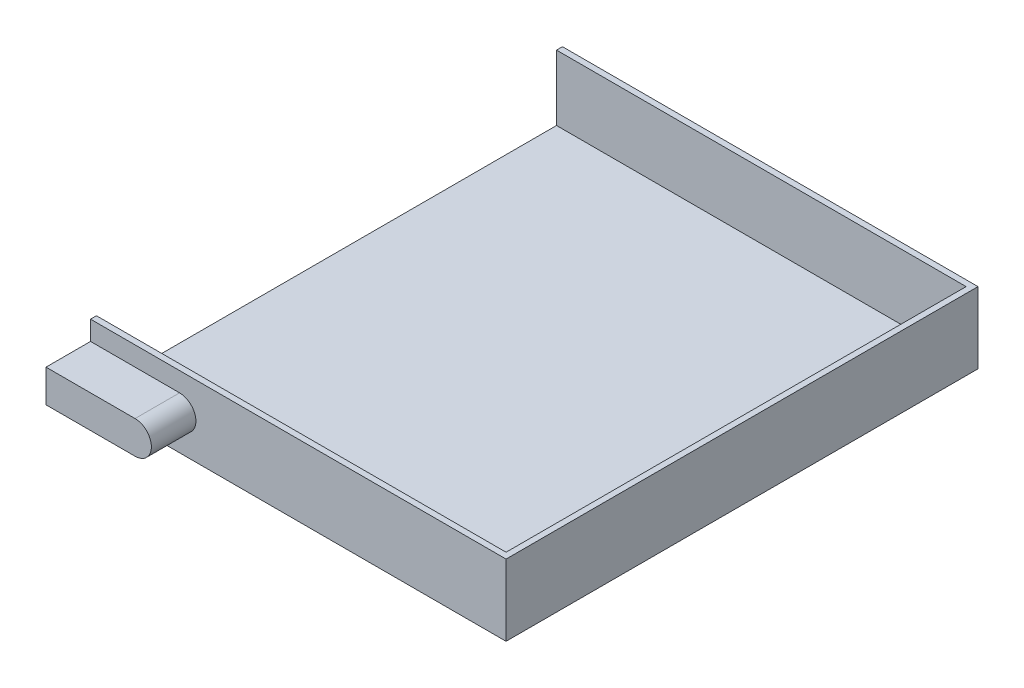
ISO-10303-21;
HEADER;
FILE_DESCRIPTION(('STEP AP214'),'2;1');
FILE_NAME('part.step','',(''),(''),'','','');
FILE_SCHEMA(('AUTOMOTIVE_DESIGN { 1 0 10303 214 1 1 1 1 }'));
ENDSEC;
DATA;
#1=APPLICATION_CONTEXT('core data for automotive mechanical design processes');
#2=APPLICATION_PROTOCOL_DEFINITION('international standard','automotive_design',2000,#1);
#3=PRODUCT_CONTEXT('',#1,'mechanical');
#4=PRODUCT('Part','Part','',(#3));
#5=PRODUCT_RELATED_PRODUCT_CATEGORY('part','',(#4));
#6=PRODUCT_DEFINITION_FORMATION('','',#4);
#7=PRODUCT_DEFINITION_CONTEXT('part definition',#1,'design');
#8=PRODUCT_DEFINITION('design','',#6,#7);
#9=PRODUCT_DEFINITION_SHAPE('','',#8);
#10=(LENGTH_UNIT() NAMED_UNIT(*) SI_UNIT(.MILLI.,.METRE.));
#11=(NAMED_UNIT(*) PLANE_ANGLE_UNIT() SI_UNIT($,.RADIAN.));
#12=(NAMED_UNIT(*) SI_UNIT($,.STERADIAN.) SOLID_ANGLE_UNIT());
#13=UNCERTAINTY_MEASURE_WITH_UNIT(LENGTH_MEASURE(1.E-05),#10,'distance_accuracy_value','');
#14=(GEOMETRIC_REPRESENTATION_CONTEXT(3) GLOBAL_UNCERTAINTY_ASSIGNED_CONTEXT((#13)) GLOBAL_UNIT_ASSIGNED_CONTEXT((#10,
#11,#12)) REPRESENTATION_CONTEXT('',''));
#15=CARTESIAN_POINT('',(0.,0.,0.));
#16=DIRECTION('',(0.,0.,1.));
#17=DIRECTION('',(1.,0.,0.));
#18=AXIS2_PLACEMENT_3D('',#15,#16,#17);
#19=CARTESIAN_POINT('',(0.,22.,157.));
#20=DIRECTION('',(0.,0.,-1.));
#21=DIRECTION('',(-1.,0.,0.));
#22=AXIS2_PLACEMENT_3D('',#19,#20,#21);
#23=PLANE('',#22);
#24=DIRECTION('',(1.,0.,0.));
#25=VECTOR('',#24,1.);
#26=CARTESIAN_POINT('',(30.,4.50000000000001,157.));
#27=LINE('',#26,#25);
#28=CARTESIAN_POINT('',(0.,4.5,157.));
#29=VERTEX_POINT('',#28);
#30=CARTESIAN_POINT('',(30.,4.50000000000001,157.));
#31=VERTEX_POINT('',#30);
#32=EDGE_CURVE('E144',#29,#31,#27,.T.);
#33=ORIENTED_EDGE('',*,*,#32,.F.);
#34=DIRECTION('',(0.,-1.,0.));
#35=VECTOR('',#34,1.);
#36=CARTESIAN_POINT('',(0.,22.,157.));
#37=LINE('',#36,#35);
#38=CARTESIAN_POINT('',(0.,-2.,157.));
#39=VERTEX_POINT('',#38);
#40=EDGE_CURVE('E47',#29,#39,#37,.T.);
#41=ORIENTED_EDGE('',*,*,#40,.T.);
#42=DIRECTION('',(1.,0.,0.));
#43=VECTOR('',#42,1.);
#44=CARTESIAN_POINT('',(0.,-2.,157.));
#45=LINE('',#44,#43);
#46=CARTESIAN_POINT('',(140.,-2.,157.));
#47=VERTEX_POINT('',#46);
#48=EDGE_CURVE('E186',#39,#47,#45,.T.);
#49=ORIENTED_EDGE('',*,*,#48,.T.);
#50=DIRECTION('',(0.,-1.,0.));
#51=VECTOR('',#50,1.);
#52=CARTESIAN_POINT('',(140.,22.,157.));
#53=LINE('',#52,#51);
#54=CARTESIAN_POINT('',(140.,22.,157.));
#55=VERTEX_POINT('',#54);
#56=EDGE_CURVE('E189',#55,#47,#53,.T.);
#57=ORIENTED_EDGE('',*,*,#56,.F.);
#58=DIRECTION('',(1.,0.,0.));
#59=VECTOR('',#58,1.);
#60=CARTESIAN_POINT('',(0.,22.,157.));
#61=LINE('',#60,#59);
#62=CARTESIAN_POINT('',(0.,22.,157.));
#63=VERTEX_POINT('',#62);
#64=EDGE_CURVE('E184',#63,#55,#61,.T.);
#65=ORIENTED_EDGE('',*,*,#64,.F.);
#66=CARTESIAN_POINT('',(0.,15.5,157.));
#67=VERTEX_POINT('',#66);
#68=EDGE_CURVE('E11',#63,#67,#37,.T.);
#69=ORIENTED_EDGE('',*,*,#68,.T.);
#70=DIRECTION('',(-1.,0.,0.));
#71=VECTOR('',#70,1.);
#72=CARTESIAN_POINT('',(30.,15.5,157.));
#73=LINE('',#72,#71);
#74=CARTESIAN_POINT('',(30.,15.5,157.));
#75=VERTEX_POINT('',#74);
#76=EDGE_CURVE('E58',#75,#67,#73,.T.);
#77=ORIENTED_EDGE('',*,*,#76,.F.);
#78=CARTESIAN_POINT('',(30.,10.,157.));
#79=DIRECTION('',(0.,0.,1.));
#80=DIRECTION('',(1.,0.,0.));
#81=AXIS2_PLACEMENT_3D('',#78,#79,#80);
#82=CIRCLE('',#81,5.5);
#83=EDGE_CURVE('E54',#31,#75,#82,.T.);
#84=ORIENTED_EDGE('',*,*,#83,.F.);
#85=EDGE_LOOP('',(#33,#41,#49,#57,#65,#69,#77,#84));
#86=FACE_BOUND('',#85,.T.);
#87=ADVANCED_FACE('F39',(#86),#23,.F.);
#88=CARTESIAN_POINT('',(0.,22.,0.));
#89=DIRECTION('',(1.,0.,0.));
#90=DIRECTION('',(0.,0.,-1.));
#91=AXIS2_PLACEMENT_3D('',#88,#89,#90);
#92=PLANE('',#91);
#93=DIRECTION('',(0.,0.,1.));
#94=VECTOR('',#93,1.);
#95=CARTESIAN_POINT('',(0.,22.,0.));
#96=LINE('',#95,#94);
#97=CARTESIAN_POINT('',(0.,22.,155.));
#98=VERTEX_POINT('',#97);
#99=EDGE_CURVE('E185',#98,#63,#96,.T.);
#100=ORIENTED_EDGE('',*,*,#99,.F.);
#101=DIRECTION('',(0.,-1.,0.));
#102=VECTOR('',#101,1.);
#103=CARTESIAN_POINT('',(0.,22.,155.));
#104=LINE('',#103,#102);
#105=CARTESIAN_POINT('',(0.,0.,155.));
#106=VERTEX_POINT('',#105);
#107=EDGE_CURVE('E177',#98,#106,#104,.T.);
#108=ORIENTED_EDGE('',*,*,#107,.T.);
#109=DIRECTION('',(0.,0.,1.));
#110=VECTOR('',#109,1.);
#111=CARTESIAN_POINT('',(0.,0.,0.));
#112=LINE('',#111,#110);
#113=CARTESIAN_POINT('',(0.,0.,0.));
#114=VERTEX_POINT('',#113);
#115=EDGE_CURVE('E147',#114,#106,#112,.T.);
#116=ORIENTED_EDGE('',*,*,#115,.F.);
#117=DIRECTION('',(0.,-1.,0.));
#118=VECTOR('',#117,1.);
#119=CARTESIAN_POINT('',(0.,22.,0.));
#120=LINE('',#119,#118);
#121=CARTESIAN_POINT('',(0.,22.,0.));
#122=VERTEX_POINT('',#121);
#123=EDGE_CURVE('E163',#122,#114,#120,.T.);
#124=ORIENTED_EDGE('',*,*,#123,.F.);
#125=CARTESIAN_POINT('',(0.,22.,-2.));
#126=VERTEX_POINT('',#125);
#127=EDGE_CURVE('E181',#126,#122,#96,.T.);
#128=ORIENTED_EDGE('',*,*,#127,.F.);
#129=DIRECTION('',(0.,-1.,0.));
#130=VECTOR('',#129,1.);
#131=CARTESIAN_POINT('',(0.,22.,-2.));
#132=LINE('',#131,#130);
#133=CARTESIAN_POINT('',(0.,-2.,-2.));
#134=VERTEX_POINT('',#133);
#135=EDGE_CURVE('E197',#126,#134,#132,.T.);
#136=ORIENTED_EDGE('',*,*,#135,.T.);
#137=DIRECTION('',(0.,0.,1.));
#138=VECTOR('',#137,1.);
#139=CARTESIAN_POINT('',(0.,-2.,0.));
#140=LINE('',#139,#138);
#141=EDGE_CURVE('E180',#134,#39,#140,.T.);
#142=ORIENTED_EDGE('',*,*,#141,.T.);
#143=ORIENTED_EDGE('',*,*,#40,.F.);
#144=DIRECTION('',(0.,0.,-1.));
#145=VECTOR('',#144,1.);
#146=CARTESIAN_POINT('',(0.,4.5,172.));
#147=LINE('',#146,#145);
#148=CARTESIAN_POINT('',(0.,4.5,172.));
#149=VERTEX_POINT('',#148);
#150=EDGE_CURVE('E152',#149,#29,#147,.T.);
#151=ORIENTED_EDGE('',*,*,#150,.F.);
#152=DIRECTION('',(0.,-1.,0.));
#153=VECTOR('',#152,1.);
#154=CARTESIAN_POINT('',(0.,15.5,172.));
#155=LINE('',#154,#153);
#156=CARTESIAN_POINT('',(0.,15.5,172.));
#157=VERTEX_POINT('',#156);
#158=EDGE_CURVE('E134',#157,#149,#155,.T.);
#159=ORIENTED_EDGE('',*,*,#158,.F.);
#160=DIRECTION('',(0.,0.,-1.));
#161=VECTOR('',#160,1.);
#162=CARTESIAN_POINT('',(0.,15.5,172.));
#163=LINE('',#162,#161);
#164=EDGE_CURVE('E131',#157,#67,#163,.T.);
#165=ORIENTED_EDGE('',*,*,#164,.T.);
#166=ORIENTED_EDGE('',*,*,#68,.F.);
#167=EDGE_LOOP('',(#100,#108,#116,#124,#128,#136,#142,#143,#151,#159,#165,#166));
#168=FACE_BOUND('',#167,.T.);
#169=ADVANCED_FACE('F210',(#168),#92,.F.);
#170=CARTESIAN_POINT('',(140.,22.,0.));
#171=DIRECTION('',(-1.,0.,0.));
#172=DIRECTION('',(0.,0.,1.));
#173=AXIS2_PLACEMENT_3D('',#170,#171,#172);
#174=PLANE('',#173);
#175=DIRECTION('',(0.,0.,-1.));
#176=VECTOR('',#175,1.);
#177=CARTESIAN_POINT('',(140.,-2.,0.));
#178=LINE('',#177,#176);
#179=CARTESIAN_POINT('',(140.,-2.,-2.));
#180=VERTEX_POINT('',#179);
#181=EDGE_CURVE('E188',#47,#180,#178,.T.);
#182=ORIENTED_EDGE('',*,*,#181,.T.);
#183=DIRECTION('',(0.,-1.,0.));
#184=VECTOR('',#183,1.);
#185=CARTESIAN_POINT('',(140.,22.,-2.));
#186=LINE('',#185,#184);
#187=CARTESIAN_POINT('',(140.,22.,-2.));
#188=VERTEX_POINT('',#187);
#189=EDGE_CURVE('E192',#188,#180,#186,.T.);
#190=ORIENTED_EDGE('',*,*,#189,.F.);
#191=DIRECTION('',(0.,0.,-1.));
#192=VECTOR('',#191,1.);
#193=CARTESIAN_POINT('',(140.,22.,0.));
#194=LINE('',#193,#192);
#195=EDGE_CURVE('E200',#55,#188,#194,.T.);
#196=ORIENTED_EDGE('',*,*,#195,.F.);
#197=ORIENTED_EDGE('',*,*,#56,.T.);
#198=EDGE_LOOP('',(#182,#190,#196,#197));
#199=FACE_BOUND('',#198,.T.);
#200=ADVANCED_FACE('F223',(#199),#174,.F.);
#201=CARTESIAN_POINT('',(0.,22.,-2.));
#202=DIRECTION('',(0.,0.,1.));
#203=DIRECTION('',(1.,0.,0.));
#204=AXIS2_PLACEMENT_3D('',#201,#202,#203);
#205=PLANE('',#204);
#206=DIRECTION('',(-1.,0.,0.));
#207=VECTOR('',#206,1.);
#208=CARTESIAN_POINT('',(0.,-2.,-2.));
#209=LINE('',#208,#207);
#210=EDGE_CURVE('E194',#180,#134,#209,.T.);
#211=ORIENTED_EDGE('',*,*,#210,.T.);
#212=ORIENTED_EDGE('',*,*,#135,.F.);
#213=DIRECTION('',(-1.,0.,0.));
#214=VECTOR('',#213,1.);
#215=CARTESIAN_POINT('',(0.,22.,-2.));
#216=LINE('',#215,#214);
#217=EDGE_CURVE('E202',#188,#126,#216,.T.);
#218=ORIENTED_EDGE('',*,*,#217,.F.);
#219=ORIENTED_EDGE('',*,*,#189,.T.);
#220=EDGE_LOOP('',(#211,#212,#218,#219));
#221=FACE_BOUND('',#220,.T.);
#222=ADVANCED_FACE('F256',(#221),#205,.F.);
#223=CARTESIAN_POINT('',(0.,22.,0.));
#224=DIRECTION('',(0.,1.,0.));
#225=DIRECTION('',(0.,0.,1.));
#226=AXIS2_PLACEMENT_3D('',#223,#224,#225);
#227=PLANE('',#226);
#228=DIRECTION('',(1.,0.,0.));
#229=VECTOR('',#228,1.);
#230=CARTESIAN_POINT('',(0.,22.,155.));
#231=LINE('',#230,#229);
#232=CARTESIAN_POINT('',(138.,22.,155.));
#233=VERTEX_POINT('',#232);
#234=EDGE_CURVE('E156',#98,#233,#231,.T.);
#235=ORIENTED_EDGE('',*,*,#234,.F.);
#236=ORIENTED_EDGE('',*,*,#99,.T.);
#237=ORIENTED_EDGE('',*,*,#64,.T.);
#238=ORIENTED_EDGE('',*,*,#195,.T.);
#239=ORIENTED_EDGE('',*,*,#217,.T.);
#240=ORIENTED_EDGE('',*,*,#127,.T.);
#241=DIRECTION('',(-1.,0.,0.));
#242=VECTOR('',#241,1.);
#243=CARTESIAN_POINT('',(0.,22.,0.));
#244=LINE('',#243,#242);
#245=CARTESIAN_POINT('',(138.,22.,0.));
#246=VERTEX_POINT('',#245);
#247=EDGE_CURVE('E162',#246,#122,#244,.T.);
#248=ORIENTED_EDGE('',*,*,#247,.F.);
#249=DIRECTION('',(0.,0.,-1.));
#250=VECTOR('',#249,1.);
#251=CARTESIAN_POINT('',(138.,22.,0.));
#252=LINE('',#251,#250);
#253=EDGE_CURVE('E158',#233,#246,#252,.T.);
#254=ORIENTED_EDGE('',*,*,#253,.F.);
#255=EDGE_LOOP('',(#235,#236,#237,#238,#239,#240,#248,#254));
#256=FACE_BOUND('',#255,.T.);
#257=ADVANCED_FACE('F228',(#256),#227,.T.);
#258=CARTESIAN_POINT('',(0.,-2.,0.));
#259=DIRECTION('',(0.,1.,0.));
#260=DIRECTION('',(0.,0.,1.));
#261=AXIS2_PLACEMENT_3D('',#258,#259,#260);
#262=PLANE('',#261);
#263=ORIENTED_EDGE('',*,*,#141,.F.);
#264=ORIENTED_EDGE('',*,*,#210,.F.);
#265=ORIENTED_EDGE('',*,*,#181,.F.);
#266=ORIENTED_EDGE('',*,*,#48,.F.);
#267=EDGE_LOOP('',(#263,#264,#265,#266));
#268=FACE_BOUND('',#267,.T.);
#269=ADVANCED_FACE('F41',(#268),#262,.F.);
#270=CARTESIAN_POINT('',(0.,22.,155.));
#271=DIRECTION('',(0.,0.,-1.));
#272=DIRECTION('',(-1.,0.,0.));
#273=AXIS2_PLACEMENT_3D('',#270,#271,#272);
#274=PLANE('',#273);
#275=DIRECTION('',(1.,0.,0.));
#276=VECTOR('',#275,1.);
#277=CARTESIAN_POINT('',(0.,0.,155.));
#278=LINE('',#277,#276);
#279=CARTESIAN_POINT('',(138.,0.,155.));
#280=VERTEX_POINT('',#279);
#281=EDGE_CURVE('E150',#106,#280,#278,.T.);
#282=ORIENTED_EDGE('',*,*,#281,.F.);
#283=ORIENTED_EDGE('',*,*,#107,.F.);
#284=ORIENTED_EDGE('',*,*,#234,.T.);
#285=DIRECTION('',(0.,-1.,0.));
#286=VECTOR('',#285,1.);
#287=CARTESIAN_POINT('',(138.,22.,155.));
#288=LINE('',#287,#286);
#289=EDGE_CURVE('E174',#233,#280,#288,.T.);
#290=ORIENTED_EDGE('',*,*,#289,.T.);
#291=EDGE_LOOP('',(#282,#283,#284,#290));
#292=FACE_BOUND('',#291,.T.);
#293=ADVANCED_FACE('F274',(#292),#274,.T.);
#294=CARTESIAN_POINT('',(138.,22.,0.));
#295=DIRECTION('',(-1.,0.,0.));
#296=DIRECTION('',(0.,0.,1.));
#297=AXIS2_PLACEMENT_3D('',#294,#295,#296);
#298=PLANE('',#297);
#299=DIRECTION('',(0.,0.,-1.));
#300=VECTOR('',#299,1.);
#301=CARTESIAN_POINT('',(138.,0.,0.));
#302=LINE('',#301,#300);
#303=CARTESIAN_POINT('',(138.,0.,0.));
#304=VERTEX_POINT('',#303);
#305=EDGE_CURVE('E166',#280,#304,#302,.T.);
#306=ORIENTED_EDGE('',*,*,#305,.F.);
#307=ORIENTED_EDGE('',*,*,#289,.F.);
#308=ORIENTED_EDGE('',*,*,#253,.T.);
#309=DIRECTION('',(0.,-1.,0.));
#310=VECTOR('',#309,1.);
#311=CARTESIAN_POINT('',(138.,22.,0.));
#312=LINE('',#311,#310);
#313=EDGE_CURVE('E171',#246,#304,#312,.T.);
#314=ORIENTED_EDGE('',*,*,#313,.T.);
#315=EDGE_LOOP('',(#306,#307,#308,#314));
#316=FACE_BOUND('',#315,.T.);
#317=ADVANCED_FACE('F272',(#316),#298,.T.);
#318=CARTESIAN_POINT('',(0.,22.,0.));
#319=DIRECTION('',(0.,0.,1.));
#320=DIRECTION('',(1.,0.,0.));
#321=AXIS2_PLACEMENT_3D('',#318,#319,#320);
#322=PLANE('',#321);
#323=DIRECTION('',(-1.,0.,0.));
#324=VECTOR('',#323,1.);
#325=CARTESIAN_POINT('',(0.,0.,0.));
#326=LINE('',#325,#324);
#327=EDGE_CURVE('E159',#304,#114,#326,.T.);
#328=ORIENTED_EDGE('',*,*,#327,.F.);
#329=ORIENTED_EDGE('',*,*,#313,.F.);
#330=ORIENTED_EDGE('',*,*,#247,.T.);
#331=ORIENTED_EDGE('',*,*,#123,.T.);
#332=EDGE_LOOP('',(#328,#329,#330,#331));
#333=FACE_BOUND('',#332,.T.);
#334=ADVANCED_FACE('F268',(#333),#322,.T.);
#335=CARTESIAN_POINT('',(0.,0.,0.));
#336=DIRECTION('',(0.,1.,0.));
#337=DIRECTION('',(0.,0.,1.));
#338=AXIS2_PLACEMENT_3D('',#335,#336,#337);
#339=PLANE('',#338);
#340=ORIENTED_EDGE('',*,*,#115,.T.);
#341=ORIENTED_EDGE('',*,*,#281,.T.);
#342=ORIENTED_EDGE('',*,*,#305,.T.);
#343=ORIENTED_EDGE('',*,*,#327,.T.);
#344=EDGE_LOOP('',(#340,#341,#342,#343));
#345=FACE_BOUND('',#344,.T.);
#346=ADVANCED_FACE('F276',(#345),#339,.T.);
#347=CARTESIAN_POINT('',(30.,10.,172.));
#348=DIRECTION('',(0.,0.,-1.));
#349=DIRECTION('',(-1.,0.,0.));
#350=AXIS2_PLACEMENT_3D('',#347,#348,#349);
#351=CYLINDRICAL_SURFACE('',#350,5.5);
#352=ORIENTED_EDGE('',*,*,#83,.T.);
#353=DIRECTION('',(0.,0.,-1.));
#354=VECTOR('',#353,1.);
#355=CARTESIAN_POINT('',(30.,15.5,172.));
#356=LINE('',#355,#354);
#357=CARTESIAN_POINT('',(30.,15.5,172.));
#358=VERTEX_POINT('',#357);
#359=EDGE_CURVE('E129',#358,#75,#356,.T.);
#360=ORIENTED_EDGE('',*,*,#359,.F.);
#361=CARTESIAN_POINT('',(30.,10.,172.));
#362=DIRECTION('',(0.,0.,1.));
#363=DIRECTION('',(1.,0.,0.));
#364=AXIS2_PLACEMENT_3D('',#361,#362,#363);
#365=CIRCLE('',#364,5.5);
#366=CARTESIAN_POINT('',(30.,4.50000000000001,172.));
#367=VERTEX_POINT('',#366);
#368=EDGE_CURVE('E135',#367,#358,#365,.T.);
#369=ORIENTED_EDGE('',*,*,#368,.F.);
#370=DIRECTION('',(0.,0.,-1.));
#371=VECTOR('',#370,1.);
#372=CARTESIAN_POINT('',(30.,4.50000000000001,172.));
#373=LINE('',#372,#371);
#374=EDGE_CURVE('E231',#367,#31,#373,.T.);
#375=ORIENTED_EDGE('',*,*,#374,.T.);
#376=EDGE_LOOP('',(#352,#360,#369,#375));
#377=FACE_BOUND('',#376,.T.);
#378=ADVANCED_FACE('F146',(#377),#351,.T.);
#379=CARTESIAN_POINT('',(30.,15.5,172.));
#380=DIRECTION('',(0.,-1.,0.));
#381=DIRECTION('',(1.,0.,0.));
#382=AXIS2_PLACEMENT_3D('',#379,#380,#381);
#383=PLANE('',#382);
#384=ORIENTED_EDGE('',*,*,#76,.T.);
#385=ORIENTED_EDGE('',*,*,#164,.F.);
#386=DIRECTION('',(-1.,0.,0.));
#387=VECTOR('',#386,1.);
#388=CARTESIAN_POINT('',(30.,15.5,172.));
#389=LINE('',#388,#387);
#390=EDGE_CURVE('E125',#358,#157,#389,.T.);
#391=ORIENTED_EDGE('',*,*,#390,.F.);
#392=ORIENTED_EDGE('',*,*,#359,.T.);
#393=EDGE_LOOP('',(#384,#385,#391,#392));
#394=FACE_BOUND('',#393,.T.);
#395=ADVANCED_FACE('F127',(#394),#383,.F.);
#396=CARTESIAN_POINT('',(30.,4.50000000000001,172.));
#397=DIRECTION('',(0.,1.,0.));
#398=DIRECTION('',(-1.,0.,0.));
#399=AXIS2_PLACEMENT_3D('',#396,#397,#398);
#400=PLANE('',#399);
#401=ORIENTED_EDGE('',*,*,#32,.T.);
#402=ORIENTED_EDGE('',*,*,#374,.F.);
#403=DIRECTION('',(1.,0.,0.));
#404=VECTOR('',#403,1.);
#405=CARTESIAN_POINT('',(30.,4.50000000000001,172.));
#406=LINE('',#405,#404);
#407=EDGE_CURVE('E140',#149,#367,#406,.T.);
#408=ORIENTED_EDGE('',*,*,#407,.F.);
#409=ORIENTED_EDGE('',*,*,#150,.T.);
#410=EDGE_LOOP('',(#401,#402,#408,#409));
#411=FACE_BOUND('',#410,.T.);
#412=ADVANCED_FACE('F238',(#411),#400,.F.);
#413=CARTESIAN_POINT('',(30.,10.,172.));
#414=DIRECTION('',(0.,0.,1.));
#415=DIRECTION('',(1.,0.,0.));
#416=AXIS2_PLACEMENT_3D('',#413,#414,#415);
#417=PLANE('',#416);
#418=ORIENTED_EDGE('',*,*,#368,.T.);
#419=ORIENTED_EDGE('',*,*,#390,.T.);
#420=ORIENTED_EDGE('',*,*,#158,.T.);
#421=ORIENTED_EDGE('',*,*,#407,.T.);
#422=EDGE_LOOP('',(#418,#419,#420,#421));
#423=FACE_BOUND('',#422,.T.);
#424=ADVANCED_FACE('F138',(#423),#417,.T.);
#425=CLOSED_SHELL('',(#87,#169,#200,#222,#257,#269,#293,#317,#334,#346,#378,#395,#412,#424));
#426=MANIFOLD_SOLID_BREP('B2',#425);
#427=ADVANCED_BREP_SHAPE_REPRESENTATION('',(#18,#426),#14);
#428=SHAPE_DEFINITION_REPRESENTATION(#9,#427);
ENDSEC;
END-ISO-10303-21;
